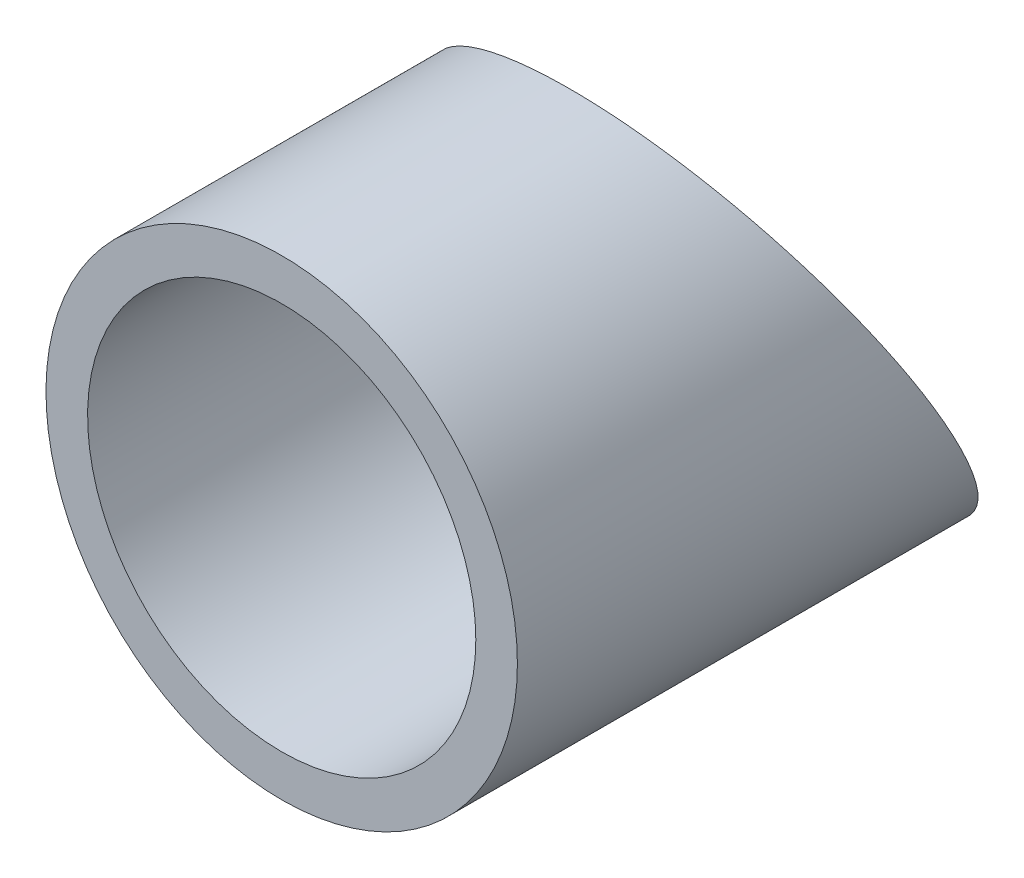
ISO-10303-21;
HEADER;
FILE_DESCRIPTION(('STEP AP214'),'2;1');
FILE_NAME('part.step','',(''),(''),'','','');
FILE_SCHEMA(('AUTOMOTIVE_DESIGN { 1 0 10303 214 1 1 1 1 }'));
ENDSEC;
DATA;
#1=APPLICATION_CONTEXT('core data for automotive mechanical design processes');
#2=APPLICATION_PROTOCOL_DEFINITION('international standard','automotive_design',2000,#1);
#3=PRODUCT_CONTEXT('',#1,'mechanical');
#4=PRODUCT('Part','Part','',(#3));
#5=PRODUCT_RELATED_PRODUCT_CATEGORY('part','',(#4));
#6=PRODUCT_DEFINITION_FORMATION('','',#4);
#7=PRODUCT_DEFINITION_CONTEXT('part definition',#1,'design');
#8=PRODUCT_DEFINITION('design','',#6,#7);
#9=PRODUCT_DEFINITION_SHAPE('','',#8);
#10=(LENGTH_UNIT() NAMED_UNIT(*) SI_UNIT(.MILLI.,.METRE.));
#11=(NAMED_UNIT(*) PLANE_ANGLE_UNIT() SI_UNIT($,.RADIAN.));
#12=(NAMED_UNIT(*) SI_UNIT($,.STERADIAN.) SOLID_ANGLE_UNIT());
#13=UNCERTAINTY_MEASURE_WITH_UNIT(LENGTH_MEASURE(1.E-05),#10,'distance_accuracy_value','');
#14=(GEOMETRIC_REPRESENTATION_CONTEXT(3) GLOBAL_UNCERTAINTY_ASSIGNED_CONTEXT((#13)) GLOBAL_UNIT_ASSIGNED_CONTEXT((#10,
#11,#12)) REPRESENTATION_CONTEXT('',''));
#15=CARTESIAN_POINT('',(0.,0.,0.));
#16=DIRECTION('',(0.,0.,1.));
#17=DIRECTION('',(1.,0.,0.));
#18=AXIS2_PLACEMENT_3D('',#15,#16,#17);
#19=CARTESIAN_POINT('',(0.,0.,40.));
#20=DIRECTION('',(0.,0.,1.));
#21=DIRECTION('',(1.,0.,0.));
#22=AXIS2_PLACEMENT_3D('',#19,#20,#21);
#23=PLANE('',#22);
#24=CARTESIAN_POINT('',(0.,0.,40.));
#25=DIRECTION('',(0.,0.,1.));
#26=DIRECTION('',(1.,0.,0.));
#27=AXIS2_PLACEMENT_3D('',#24,#25,#26);
#28=CIRCLE('',#27,17.);
#29=CARTESIAN_POINT('',(17.,0.,40.));
#30=VERTEX_POINT('',#29);
#31=EDGE_CURVE('E11',#30,#30,#28,.T.);
#32=ORIENTED_EDGE('',*,*,#31,.T.);
#33=EDGE_LOOP('',(#32));
#34=FACE_BOUND('',#33,.T.);
#35=CARTESIAN_POINT('',(0.,0.,40.));
#36=DIRECTION('',(0.,0.,1.));
#37=DIRECTION('',(1.,0.,0.));
#38=AXIS2_PLACEMENT_3D('',#35,#36,#37);
#39=CIRCLE('',#38,14.);
#40=CARTESIAN_POINT('',(14.,0.,40.));
#41=VERTEX_POINT('',#40);
#42=EDGE_CURVE('E58',#41,#41,#39,.T.);
#43=ORIENTED_EDGE('',*,*,#42,.F.);
#44=EDGE_LOOP('',(#43));
#45=FACE_BOUND('',#44,.T.);
#46=ADVANCED_FACE('F32',(#34,#45),#23,.T.);
#47=CARTESIAN_POINT('',(0.,0.,0.));
#48=DIRECTION('',(0.,0.,1.));
#49=DIRECTION('',(1.,0.,0.));
#50=AXIS2_PLACEMENT_3D('',#47,#48,#49);
#51=PLANE('',#50);
#52=CARTESIAN_POINT('',(0.,0.,0.));
#53=DIRECTION('',(0.,0.,1.));
#54=DIRECTION('',(1.,0.,0.));
#55=AXIS2_PLACEMENT_3D('',#52,#53,#54);
#56=CIRCLE('',#55,17.);
#57=CARTESIAN_POINT('',(-4.83120163851963,-16.2990641058916,0.));
#58=VERTEX_POINT('',#57);
#59=CARTESIAN_POINT('',(4.83120163851965,-16.2990641058916,0.));
#60=VERTEX_POINT('',#59);
#61=EDGE_CURVE('E41',#58,#60,#56,.T.);
#62=ORIENTED_EDGE('',*,*,#61,.F.);
#63=DIRECTION('',(1.,0.,0.));
#64=VECTOR('',#63,1.);
#65=CARTESIAN_POINT('',(0.,-16.2990641058916,0.));
#66=LINE('',#65,#64);
#67=EDGE_CURVE('E53',#58,#60,#66,.T.);
#68=ORIENTED_EDGE('',*,*,#67,.T.);
#69=EDGE_LOOP('',(#62,#68));
#70=FACE_BOUND('',#69,.T.);
#71=ADVANCED_FACE('F57',(#70),#51,.F.);
#72=CARTESIAN_POINT('',(0.,0.,40.));
#73=DIRECTION('',(0.,0.,-1.));
#74=DIRECTION('',(-1.,0.,0.));
#75=AXIS2_PLACEMENT_3D('',#72,#73,#74);
#76=CYLINDRICAL_SURFACE('',#75,17.);
#77=ORIENTED_EDGE('',*,*,#31,.F.);
#78=EDGE_LOOP('',(#77));
#79=FACE_BOUND('',#78,.T.);
#80=ORIENTED_EDGE('',*,*,#61,.T.);
#81=CARTESIAN_POINT('',(0.,0.,9.39860214139675));
#82=DIRECTION('',(0.,-0.49953485658432,0.866293787959537));
#83=DIRECTION('',(0.,-0.866293787959537,-0.49953485658432));
#84=AXIS2_PLACEMENT_3D('',#81,#82,#83);
#85=ELLIPSE('',#84,19.6238276624858,17.);
#86=EDGE_CURVE('E48',#60,#58,#85,.T.);
#87=ORIENTED_EDGE('',*,*,#86,.T.);
#88=EDGE_LOOP('',(#80,#87));
#89=FACE_BOUND('',#88,.T.);
#90=ADVANCED_FACE('F34',(#79,#89),#76,.T.);
#91=CARTESIAN_POINT('',(0.,0.,40.));
#92=DIRECTION('',(0.,0.,-1.));
#93=DIRECTION('',(-1.,0.,0.));
#94=AXIS2_PLACEMENT_3D('',#91,#92,#93);
#95=CYLINDRICAL_SURFACE('',#94,14.);
#96=CARTESIAN_POINT('',(0.,0.,9.39860214139675));
#97=DIRECTION('',(0.,-0.49953485658432,0.866293787959537));
#98=DIRECTION('',(0.,-0.866293787959537,-0.49953485658432));
#99=AXIS2_PLACEMENT_3D('',#96,#97,#98);
#100=ELLIPSE('',#99,16.1607992514589,14.);
#101=CARTESIAN_POINT('',(0.,-14.,1.32571960503124));
#102=VERTEX_POINT('',#101);
#103=EDGE_CURVE('E36',#102,#102,#100,.T.);
#104=ORIENTED_EDGE('',*,*,#103,.F.);
#105=EDGE_LOOP('',(#104));
#106=FACE_BOUND('',#105,.T.);
#107=ORIENTED_EDGE('',*,*,#42,.T.);
#108=EDGE_LOOP('',(#107));
#109=FACE_BOUND('',#108,.T.);
#110=ADVANCED_FACE('F64',(#106,#109),#95,.F.);
#111=CARTESIAN_POINT('',(-17.,43.0611811393501,34.229163371049));
#112=DIRECTION('',(0.,-0.49953485658432,0.866293787959537));
#113=DIRECTION('',(0.,-0.866293787959537,-0.49953485658432));
#114=AXIS2_PLACEMENT_3D('',#111,#112,#113);
#115=PLANE('',#114);
#116=ORIENTED_EDGE('',*,*,#103,.T.);
#117=EDGE_LOOP('',(#116));
#118=FACE_BOUND('',#117,.T.);
#119=ORIENTED_EDGE('',*,*,#86,.F.);
#120=ORIENTED_EDGE('',*,*,#67,.F.);
#121=EDGE_LOOP('',(#119,#120));
#122=FACE_BOUND('',#121,.T.);
#123=ADVANCED_FACE('F52',(#118,#122),#115,.F.);
#124=CLOSED_SHELL('',(#46,#71,#90,#110,#123));
#125=MANIFOLD_SOLID_BREP('B2',#124);
#126=ADVANCED_BREP_SHAPE_REPRESENTATION('',(#18,#125),#14);
#127=SHAPE_DEFINITION_REPRESENTATION(#9,#126);
ENDSEC;
END-ISO-10303-21;
